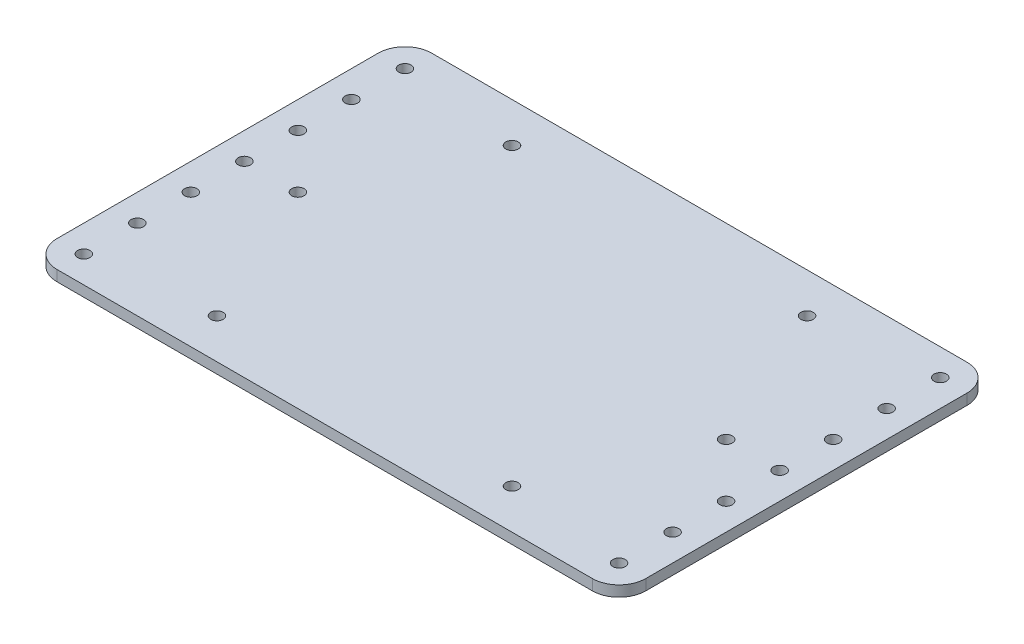
ISO-10303-21;
HEADER;
FILE_DESCRIPTION(('STEP AP214'),'2;1');
FILE_NAME('part.step','',(''),(''),'','','');
FILE_SCHEMA(('AUTOMOTIVE_DESIGN { 1 0 10303 214 1 1 1 1 }'));
ENDSEC;
DATA;
#1=APPLICATION_CONTEXT('core data for automotive mechanical design processes');
#2=APPLICATION_PROTOCOL_DEFINITION('international standard','automotive_design',2000,#1);
#3=PRODUCT_CONTEXT('',#1,'mechanical');
#4=PRODUCT('Part','Part','',(#3));
#5=PRODUCT_RELATED_PRODUCT_CATEGORY('part','',(#4));
#6=PRODUCT_DEFINITION_FORMATION('','',#4);
#7=PRODUCT_DEFINITION_CONTEXT('part definition',#1,'design');
#8=PRODUCT_DEFINITION('design','',#6,#7);
#9=PRODUCT_DEFINITION_SHAPE('','',#8);
#10=(LENGTH_UNIT() NAMED_UNIT(*) SI_UNIT(.MILLI.,.METRE.));
#11=(NAMED_UNIT(*) PLANE_ANGLE_UNIT() SI_UNIT($,.RADIAN.));
#12=(NAMED_UNIT(*) SI_UNIT($,.STERADIAN.) SOLID_ANGLE_UNIT());
#13=UNCERTAINTY_MEASURE_WITH_UNIT(LENGTH_MEASURE(1.E-05),#10,'distance_accuracy_value','');
#14=(GEOMETRIC_REPRESENTATION_CONTEXT(3) GLOBAL_UNCERTAINTY_ASSIGNED_CONTEXT((#13)) GLOBAL_UNIT_ASSIGNED_CONTEXT((#10,
#11,#12)) REPRESENTATION_CONTEXT('',''));
#15=CARTESIAN_POINT('',(0.,0.,0.));
#16=DIRECTION('',(0.,0.,1.));
#17=DIRECTION('',(1.,0.,0.));
#18=AXIS2_PLACEMENT_3D('',#15,#16,#17);
#19=CARTESIAN_POINT('',(0.,2.54,0.));
#20=DIRECTION('',(0.,1.,0.));
#21=DIRECTION('',(0.,0.,1.));
#22=AXIS2_PLACEMENT_3D('',#19,#20,#21);
#23=PLANE('',#22);
#24=CARTESIAN_POINT('',(19.0500000000014,2.54,44.45));
#25=DIRECTION('',(0.,1.,0.));
#26=DIRECTION('',(0.,0.,1.));
#27=AXIS2_PLACEMENT_3D('',#24,#25,#26);
#28=CIRCLE('',#27,1.47319999999985);
#29=CARTESIAN_POINT('',(19.0500000000014,2.54,45.9231999999999));
#30=VERTEX_POINT('',#29);
#31=EDGE_CURVE('E351',#30,#30,#28,.T.);
#32=ORIENTED_EDGE('',*,*,#31,.F.);
#33=EDGE_LOOP('',(#32));
#34=FACE_BOUND('',#33,.T.);
#35=CARTESIAN_POINT('',(133.350000000001,2.54,19.0499999999987));
#36=DIRECTION('',(0.,1.,0.));
#37=DIRECTION('',(0.,0.,-1.));
#38=AXIS2_PLACEMENT_3D('',#35,#36,#37);
#39=CIRCLE('',#38,1.4731999999986);
#40=CARTESIAN_POINT('',(133.350000000001,2.54,17.5768));
#41=VERTEX_POINT('',#40);
#42=EDGE_CURVE('E335',#41,#41,#39,.T.);
#43=ORIENTED_EDGE('',*,*,#42,.F.);
#44=EDGE_LOOP('',(#43));
#45=FACE_BOUND('',#44,.T.);
#46=CARTESIAN_POINT('',(133.35,2.54,44.4499999999987));
#47=DIRECTION('',(0.,1.,0.));
#48=DIRECTION('',(0.,0.,-1.));
#49=AXIS2_PLACEMENT_3D('',#46,#47,#48);
#50=CIRCLE('',#49,1.47319999999876);
#51=CARTESIAN_POINT('',(133.35,2.54,42.9767999999999));
#52=VERTEX_POINT('',#51);
#53=EDGE_CURVE('E319',#52,#52,#50,.T.);
#54=ORIENTED_EDGE('',*,*,#53,.F.);
#55=EDGE_LOOP('',(#54));
#56=FACE_BOUND('',#55,.T.);
#57=CARTESIAN_POINT('',(133.350000000001,2.54,69.8499999999987));
#58=DIRECTION('',(0.,1.,0.));
#59=DIRECTION('',(0.,0.,-1.));
#60=AXIS2_PLACEMENT_3D('',#57,#58,#59);
#61=CIRCLE('',#60,1.47319999999829);
#62=CARTESIAN_POINT('',(133.350000000001,2.54,68.3768000000004));
#63=VERTEX_POINT('',#62);
#64=EDGE_CURVE('E303',#63,#63,#61,.T.);
#65=ORIENTED_EDGE('',*,*,#64,.F.);
#66=EDGE_LOOP('',(#65));
#67=FACE_BOUND('',#66,.T.);
#68=CARTESIAN_POINT('',(104.85,2.54,79.4500000000001));
#69=DIRECTION('',(0.,1.,0.));
#70=DIRECTION('',(0.,0.,1.));
#71=AXIS2_PLACEMENT_3D('',#68,#69,#70);
#72=CIRCLE('',#71,1.4732);
#73=CARTESIAN_POINT('',(104.85,2.54,80.9232000000001));
#74=VERTEX_POINT('',#73);
#75=EDGE_CURVE('E287',#74,#74,#72,.T.);
#76=ORIENTED_EDGE('',*,*,#75,.F.);
#77=EDGE_LOOP('',(#76));
#78=FACE_BOUND('',#77,.T.);
#79=CARTESIAN_POINT('',(104.85,2.54,9.44999999999999));
#80=DIRECTION('',(0.,1.,0.));
#81=DIRECTION('',(0.,0.,1.));
#82=AXIS2_PLACEMENT_3D('',#79,#80,#81);
#83=CIRCLE('',#82,1.4732);
#84=CARTESIAN_POINT('',(104.85,2.54,10.9232));
#85=VERTEX_POINT('',#84);
#86=EDGE_CURVE('E271',#85,#85,#83,.T.);
#87=ORIENTED_EDGE('',*,*,#86,.F.);
#88=EDGE_LOOP('',(#87));
#89=FACE_BOUND('',#88,.T.);
#90=CARTESIAN_POINT('',(6.3500000000025,2.54,82.55));
#91=DIRECTION('',(0.,1.,0.));
#92=DIRECTION('',(0.,0.,1.));
#93=AXIS2_PLACEMENT_3D('',#90,#91,#92);
#94=CIRCLE('',#93,1.47319999999836);
#95=CARTESIAN_POINT('',(6.3500000000025,2.54,84.0231999999983));
#96=VERTEX_POINT('',#95);
#97=EDGE_CURVE('E255',#96,#96,#94,.T.);
#98=ORIENTED_EDGE('',*,*,#97,.F.);
#99=EDGE_LOOP('',(#98));
#100=FACE_BOUND('',#99,.T.);
#101=CARTESIAN_POINT('',(6.35000000000224,2.54,57.15));
#102=DIRECTION('',(0.,1.,0.));
#103=DIRECTION('',(0.,0.,1.));
#104=AXIS2_PLACEMENT_3D('',#101,#102,#103);
#105=CIRCLE('',#104,1.47319999999836);
#106=CARTESIAN_POINT('',(6.35000000000224,2.54,58.6231999999983));
#107=VERTEX_POINT('',#106);
#108=EDGE_CURVE('E239',#107,#107,#105,.T.);
#109=ORIENTED_EDGE('',*,*,#108,.F.);
#110=EDGE_LOOP('',(#109));
#111=FACE_BOUND('',#110,.T.);
#112=CARTESIAN_POINT('',(6.35000000000197,2.54,31.75));
#113=DIRECTION('',(0.,1.,0.));
#114=DIRECTION('',(0.,0.,1.));
#115=AXIS2_PLACEMENT_3D('',#112,#113,#114);
#116=CIRCLE('',#115,1.47319999999836);
#117=CARTESIAN_POINT('',(6.35000000000197,2.54,33.2231999999984));
#118=VERTEX_POINT('',#117);
#119=EDGE_CURVE('E223',#118,#118,#116,.T.);
#120=ORIENTED_EDGE('',*,*,#119,.F.);
#121=EDGE_LOOP('',(#120));
#122=FACE_BOUND('',#121,.T.);
#123=CARTESIAN_POINT('',(6.35000000000184,2.54,19.05));
#124=DIRECTION('',(0.,1.,0.));
#125=DIRECTION('',(0.,0.,1.));
#126=AXIS2_PLACEMENT_3D('',#123,#124,#125);
#127=CIRCLE('',#126,1.47319999999836);
#128=CARTESIAN_POINT('',(6.35000000000184,2.54,20.5231999999984));
#129=VERTEX_POINT('',#128);
#130=EDGE_CURVE('E141',#129,#129,#127,.T.);
#131=ORIENTED_EDGE('',*,*,#130,.F.);
#132=EDGE_LOOP('',(#131));
#133=FACE_BOUND('',#132,.T.);
#134=DIRECTION('',(-1.,0.,0.));
#135=VECTOR('',#134,1.);
#136=CARTESIAN_POINT('',(0.,2.54,0.));
#137=LINE('',#136,#135);
#138=CARTESIAN_POINT('',(133.35,2.54,0.));
#139=VERTEX_POINT('',#138);
#140=CARTESIAN_POINT('',(6.35,2.54,0.));
#141=VERTEX_POINT('',#140);
#142=EDGE_CURVE('E152',#139,#141,#137,.T.);
#143=ORIENTED_EDGE('',*,*,#142,.T.);
#144=CARTESIAN_POINT('',(6.35,2.54,6.35));
#145=DIRECTION('',(0.,1.,0.));
#146=DIRECTION('',(0.,0.,1.));
#147=AXIS2_PLACEMENT_3D('',#144,#145,#146);
#148=CIRCLE('',#147,6.35);
#149=CARTESIAN_POINT('',(0.,2.54,6.35));
#150=VERTEX_POINT('',#149);
#151=EDGE_CURVE('E182',#141,#150,#148,.T.);
#152=ORIENTED_EDGE('',*,*,#151,.T.);
#153=DIRECTION('',(0.,0.,1.));
#154=VECTOR('',#153,1.);
#155=CARTESIAN_POINT('',(0.,2.54,0.));
#156=LINE('',#155,#154);
#157=CARTESIAN_POINT('',(0.,2.54,82.55));
#158=VERTEX_POINT('',#157);
#159=EDGE_CURVE('E131',#150,#158,#156,.T.);
#160=ORIENTED_EDGE('',*,*,#159,.T.);
#161=CARTESIAN_POINT('',(6.35,2.54,82.55));
#162=DIRECTION('',(0.,1.,0.));
#163=DIRECTION('',(0.,0.,1.));
#164=AXIS2_PLACEMENT_3D('',#161,#162,#163);
#165=CIRCLE('',#164,6.35);
#166=CARTESIAN_POINT('',(6.35,2.54,88.9));
#167=VERTEX_POINT('',#166);
#168=EDGE_CURVE('E174',#158,#167,#165,.T.);
#169=ORIENTED_EDGE('',*,*,#168,.T.);
#170=DIRECTION('',(1.,0.,0.));
#171=VECTOR('',#170,1.);
#172=CARTESIAN_POINT('',(0.,2.54,88.9));
#173=LINE('',#172,#171);
#174=CARTESIAN_POINT('',(133.35,2.54,88.9));
#175=VERTEX_POINT('',#174);
#176=EDGE_CURVE('E197',#167,#175,#173,.T.);
#177=ORIENTED_EDGE('',*,*,#176,.T.);
#178=CARTESIAN_POINT('',(133.35,2.54,82.55));
#179=DIRECTION('',(0.,1.,0.));
#180=DIRECTION('',(0.,0.,1.));
#181=AXIS2_PLACEMENT_3D('',#178,#179,#180);
#182=CIRCLE('',#181,6.35);
#183=CARTESIAN_POINT('',(139.7,2.54,82.55));
#184=VERTEX_POINT('',#183);
#185=EDGE_CURVE('E66',#175,#184,#182,.T.);
#186=ORIENTED_EDGE('',*,*,#185,.T.);
#187=DIRECTION('',(0.,0.,-1.));
#188=VECTOR('',#187,1.);
#189=CARTESIAN_POINT('',(139.7,2.54,0.));
#190=LINE('',#189,#188);
#191=CARTESIAN_POINT('',(139.7,2.54,6.35));
#192=VERTEX_POINT('',#191);
#193=EDGE_CURVE('E205',#184,#192,#190,.T.);
#194=ORIENTED_EDGE('',*,*,#193,.T.);
#195=CARTESIAN_POINT('',(133.35,2.54,6.35));
#196=DIRECTION('',(0.,1.,0.));
#197=DIRECTION('',(0.,0.,1.));
#198=AXIS2_PLACEMENT_3D('',#195,#196,#197);
#199=CIRCLE('',#198,6.35);
#200=EDGE_CURVE('E179',#192,#139,#199,.T.);
#201=ORIENTED_EDGE('',*,*,#200,.T.);
#202=EDGE_LOOP('',(#143,#152,#160,#169,#177,#186,#194,#201));
#203=FACE_BOUND('',#202,.T.);
#204=CARTESIAN_POINT('',(6.35000000000171,2.54,6.34999999999999));
#205=DIRECTION('',(0.,1.,0.));
#206=DIRECTION('',(0.,0.,1.));
#207=AXIS2_PLACEMENT_3D('',#204,#205,#206);
#208=CIRCLE('',#207,1.47319999999836);
#209=CARTESIAN_POINT('',(6.35000000000171,2.54,7.82319999999836));
#210=VERTEX_POINT('',#209);
#211=EDGE_CURVE('E217',#210,#210,#208,.T.);
#212=ORIENTED_EDGE('',*,*,#211,.F.);
#213=EDGE_LOOP('',(#212));
#214=FACE_BOUND('',#213,.T.);
#215=CARTESIAN_POINT('',(6.3500000000021,2.54,44.45));
#216=DIRECTION('',(0.,1.,0.));
#217=DIRECTION('',(0.,0.,1.));
#218=AXIS2_PLACEMENT_3D('',#215,#216,#217);
#219=CIRCLE('',#218,1.47319999999836);
#220=CARTESIAN_POINT('',(6.3500000000021,2.54,45.9231999999984));
#221=VERTEX_POINT('',#220);
#222=EDGE_CURVE('E231',#221,#221,#219,.T.);
#223=ORIENTED_EDGE('',*,*,#222,.F.);
#224=EDGE_LOOP('',(#223));
#225=FACE_BOUND('',#224,.T.);
#226=CARTESIAN_POINT('',(6.35000000000237,2.54,69.85));
#227=DIRECTION('',(0.,1.,0.));
#228=DIRECTION('',(0.,0.,1.));
#229=AXIS2_PLACEMENT_3D('',#226,#227,#228);
#230=CIRCLE('',#229,1.47319999999836);
#231=CARTESIAN_POINT('',(6.35000000000237,2.54,71.3231999999983));
#232=VERTEX_POINT('',#231);
#233=EDGE_CURVE('E247',#232,#232,#230,.T.);
#234=ORIENTED_EDGE('',*,*,#233,.F.);
#235=EDGE_LOOP('',(#234));
#236=FACE_BOUND('',#235,.T.);
#237=CARTESIAN_POINT('',(133.350000000001,2.54,82.5499999999986));
#238=DIRECTION('',(0.,1.,0.));
#239=DIRECTION('',(0.,0.,-1.));
#240=AXIS2_PLACEMENT_3D('',#237,#238,#239);
#241=CIRCLE('',#240,1.47319999999805);
#242=CARTESIAN_POINT('',(133.350000000001,2.54,81.0768000000006));
#243=VERTEX_POINT('',#242);
#244=EDGE_CURVE('E263',#243,#243,#241,.T.);
#245=ORIENTED_EDGE('',*,*,#244,.F.);
#246=EDGE_LOOP('',(#245));
#247=FACE_BOUND('',#246,.T.);
#248=CARTESIAN_POINT('',(34.85,2.54,9.44999999999999));
#249=DIRECTION('',(0.,1.,0.));
#250=DIRECTION('',(0.,0.,1.));
#251=AXIS2_PLACEMENT_3D('',#248,#249,#250);
#252=CIRCLE('',#251,1.4732);
#253=CARTESIAN_POINT('',(34.85,2.54,10.9232));
#254=VERTEX_POINT('',#253);
#255=EDGE_CURVE('E279',#254,#254,#252,.T.);
#256=ORIENTED_EDGE('',*,*,#255,.F.);
#257=EDGE_LOOP('',(#256));
#258=FACE_BOUND('',#257,.T.);
#259=CARTESIAN_POINT('',(34.85,2.54,79.4500000000001));
#260=DIRECTION('',(0.,1.,0.));
#261=DIRECTION('',(0.,0.,1.));
#262=AXIS2_PLACEMENT_3D('',#259,#260,#261);
#263=CIRCLE('',#262,1.47320000000024);
#264=CARTESIAN_POINT('',(34.85,2.54,80.9232000000004));
#265=VERTEX_POINT('',#264);
#266=EDGE_CURVE('E295',#265,#265,#263,.T.);
#267=ORIENTED_EDGE('',*,*,#266,.F.);
#268=EDGE_LOOP('',(#267));
#269=FACE_BOUND('',#268,.T.);
#270=CARTESIAN_POINT('',(133.350000000001,2.54,57.1499999999987));
#271=DIRECTION('',(0.,1.,0.));
#272=DIRECTION('',(0.,0.,-1.));
#273=AXIS2_PLACEMENT_3D('',#270,#271,#272);
#274=CIRCLE('',#273,1.47319999999858);
#275=CARTESIAN_POINT('',(133.350000000001,2.54,55.6768000000001));
#276=VERTEX_POINT('',#275);
#277=EDGE_CURVE('E311',#276,#276,#274,.T.);
#278=ORIENTED_EDGE('',*,*,#277,.F.);
#279=EDGE_LOOP('',(#278));
#280=FACE_BOUND('',#279,.T.);
#281=CARTESIAN_POINT('',(133.350000000001,2.54,31.7499999999987));
#282=DIRECTION('',(0.,1.,0.));
#283=DIRECTION('',(0.,0.,-1.));
#284=AXIS2_PLACEMENT_3D('',#281,#282,#283);
#285=CIRCLE('',#284,1.47319999999837);
#286=CARTESIAN_POINT('',(133.350000000001,2.54,30.2768000000003));
#287=VERTEX_POINT('',#286);
#288=EDGE_CURVE('E327',#287,#287,#285,.T.);
#289=ORIENTED_EDGE('',*,*,#288,.F.);
#290=EDGE_LOOP('',(#289));
#291=FACE_BOUND('',#290,.T.);
#292=CARTESIAN_POINT('',(133.350000000001,2.54,6.34999999999866));
#293=DIRECTION('',(0.,1.,0.));
#294=DIRECTION('',(0.,0.,-1.));
#295=AXIS2_PLACEMENT_3D('',#292,#293,#294);
#296=CIRCLE('',#295,1.47319999999882);
#297=CARTESIAN_POINT('',(133.350000000001,2.54,4.87679999999984));
#298=VERTEX_POINT('',#297);
#299=EDGE_CURVE('E343',#298,#298,#296,.T.);
#300=ORIENTED_EDGE('',*,*,#299,.F.);
#301=EDGE_LOOP('',(#300));
#302=FACE_BOUND('',#301,.T.);
#303=CARTESIAN_POINT('',(120.650000000001,2.54,44.45));
#304=DIRECTION('',(0.,1.,0.));
#305=DIRECTION('',(0.,0.,1.));
#306=AXIS2_PLACEMENT_3D('',#303,#304,#305);
#307=CIRCLE('',#306,1.47319999999977);
#308=CARTESIAN_POINT('',(120.650000000001,2.54,45.9231999999998));
#309=VERTEX_POINT('',#308);
#310=EDGE_CURVE('E359',#309,#309,#307,.T.);
#311=ORIENTED_EDGE('',*,*,#310,.F.);
#312=EDGE_LOOP('',(#311));
#313=FACE_BOUND('',#312,.T.);
#314=ADVANCED_FACE('F43',(#34,#45,#56,#67,#78,#89,#100,#111,#122,#133,#203,#214,#225,#236,#247,
#258,#269,#280,#291,#302,#313),#23,.T.);
#315=CARTESIAN_POINT('',(0.,0.,0.));
#316=DIRECTION('',(0.,1.,0.));
#317=DIRECTION('',(0.,0.,1.));
#318=AXIS2_PLACEMENT_3D('',#315,#316,#317);
#319=PLANE('',#318);
#320=DIRECTION('',(0.,0.,1.));
#321=VECTOR('',#320,1.);
#322=CARTESIAN_POINT('',(0.,0.,0.));
#323=LINE('',#322,#321);
#324=CARTESIAN_POINT('',(0.,0.,6.35));
#325=VERTEX_POINT('',#324);
#326=CARTESIAN_POINT('',(0.,0.,82.55));
#327=VERTEX_POINT('',#326);
#328=EDGE_CURVE('E128',#325,#327,#323,.T.);
#329=ORIENTED_EDGE('',*,*,#328,.F.);
#330=CARTESIAN_POINT('',(6.35,0.,6.35));
#331=DIRECTION('',(0.,1.,0.));
#332=DIRECTION('',(0.,0.,1.));
#333=AXIS2_PLACEMENT_3D('',#330,#331,#332);
#334=CIRCLE('',#333,6.35);
#335=CARTESIAN_POINT('',(6.35,0.,0.));
#336=VERTEX_POINT('',#335);
#337=EDGE_CURVE('E110',#325,#336,#334,.F.);
#338=ORIENTED_EDGE('',*,*,#337,.T.);
#339=DIRECTION('',(-1.,0.,0.));
#340=VECTOR('',#339,1.);
#341=CARTESIAN_POINT('',(0.,0.,0.));
#342=LINE('',#341,#340);
#343=CARTESIAN_POINT('',(133.35,0.,0.));
#344=VERTEX_POINT('',#343);
#345=EDGE_CURVE('E157',#344,#336,#342,.T.);
#346=ORIENTED_EDGE('',*,*,#345,.F.);
#347=CARTESIAN_POINT('',(133.35,0.,6.35));
#348=DIRECTION('',(0.,1.,0.));
#349=DIRECTION('',(0.,0.,1.));
#350=AXIS2_PLACEMENT_3D('',#347,#348,#349);
#351=CIRCLE('',#350,6.35);
#352=CARTESIAN_POINT('',(139.7,0.,6.35));
#353=VERTEX_POINT('',#352);
#354=EDGE_CURVE('E122',#344,#353,#351,.F.);
#355=ORIENTED_EDGE('',*,*,#354,.T.);
#356=DIRECTION('',(0.,0.,-1.));
#357=VECTOR('',#356,1.);
#358=CARTESIAN_POINT('',(139.7,0.,0.));
#359=LINE('',#358,#357);
#360=CARTESIAN_POINT('',(139.7,0.,82.55));
#361=VERTEX_POINT('',#360);
#362=EDGE_CURVE('E146',#361,#353,#359,.T.);
#363=ORIENTED_EDGE('',*,*,#362,.F.);
#364=CARTESIAN_POINT('',(133.35,0.,82.55));
#365=DIRECTION('',(0.,1.,0.));
#366=DIRECTION('',(0.,0.,1.));
#367=AXIS2_PLACEMENT_3D('',#364,#365,#366);
#368=CIRCLE('',#367,6.35);
#369=CARTESIAN_POINT('',(133.35,0.,88.9));
#370=VERTEX_POINT('',#369);
#371=EDGE_CURVE('E164',#361,#370,#368,.F.);
#372=ORIENTED_EDGE('',*,*,#371,.T.);
#373=DIRECTION('',(1.,0.,0.));
#374=VECTOR('',#373,1.);
#375=CARTESIAN_POINT('',(0.,0.,88.9));
#376=LINE('',#375,#374);
#377=CARTESIAN_POINT('',(6.35,0.,88.9));
#378=VERTEX_POINT('',#377);
#379=EDGE_CURVE('E140',#378,#370,#376,.T.);
#380=ORIENTED_EDGE('',*,*,#379,.F.);
#381=CARTESIAN_POINT('',(6.35,0.,82.55));
#382=DIRECTION('',(0.,1.,0.));
#383=DIRECTION('',(0.,0.,1.));
#384=AXIS2_PLACEMENT_3D('',#381,#382,#383);
#385=CIRCLE('',#384,6.35);
#386=EDGE_CURVE('E133',#378,#327,#385,.F.);
#387=ORIENTED_EDGE('',*,*,#386,.T.);
#388=EDGE_LOOP('',(#329,#338,#346,#355,#363,#372,#380,#387));
#389=FACE_BOUND('',#388,.T.);
#390=CARTESIAN_POINT('',(6.35000000000184,0.,19.05));
#391=DIRECTION('',(0.,1.,0.));
#392=DIRECTION('',(0.,0.,1.));
#393=AXIS2_PLACEMENT_3D('',#390,#391,#392);
#394=CIRCLE('',#393,1.47319999999836);
#395=CARTESIAN_POINT('',(6.35000000000184,0.,20.5231999999984));
#396=VERTEX_POINT('',#395);
#397=EDGE_CURVE('E149',#396,#396,#394,.T.);
#398=ORIENTED_EDGE('',*,*,#397,.T.);
#399=EDGE_LOOP('',(#398));
#400=FACE_BOUND('',#399,.T.);
#401=CARTESIAN_POINT('',(6.35000000000171,0.,6.34999999999999));
#402=DIRECTION('',(0.,1.,0.));
#403=DIRECTION('',(0.,0.,1.));
#404=AXIS2_PLACEMENT_3D('',#401,#402,#403);
#405=CIRCLE('',#404,1.47319999999836);
#406=CARTESIAN_POINT('',(6.35000000000171,0.,7.82319999999836));
#407=VERTEX_POINT('',#406);
#408=EDGE_CURVE('E219',#407,#407,#405,.T.);
#409=ORIENTED_EDGE('',*,*,#408,.T.);
#410=EDGE_LOOP('',(#409));
#411=FACE_BOUND('',#410,.T.);
#412=CARTESIAN_POINT('',(6.35000000000197,0.,31.75));
#413=DIRECTION('',(0.,1.,0.));
#414=DIRECTION('',(0.,0.,1.));
#415=AXIS2_PLACEMENT_3D('',#412,#413,#414);
#416=CIRCLE('',#415,1.47319999999836);
#417=CARTESIAN_POINT('',(6.35000000000197,0.,33.2231999999984));
#418=VERTEX_POINT('',#417);
#419=EDGE_CURVE('E227',#418,#418,#416,.T.);
#420=ORIENTED_EDGE('',*,*,#419,.T.);
#421=EDGE_LOOP('',(#420));
#422=FACE_BOUND('',#421,.T.);
#423=CARTESIAN_POINT('',(6.3500000000021,0.,44.45));
#424=DIRECTION('',(0.,1.,0.));
#425=DIRECTION('',(0.,0.,1.));
#426=AXIS2_PLACEMENT_3D('',#423,#424,#425);
#427=CIRCLE('',#426,1.47319999999836);
#428=CARTESIAN_POINT('',(6.3500000000021,0.,45.9231999999984));
#429=VERTEX_POINT('',#428);
#430=EDGE_CURVE('E235',#429,#429,#427,.T.);
#431=ORIENTED_EDGE('',*,*,#430,.T.);
#432=EDGE_LOOP('',(#431));
#433=FACE_BOUND('',#432,.T.);
#434=CARTESIAN_POINT('',(6.35000000000224,0.,57.15));
#435=DIRECTION('',(0.,1.,0.));
#436=DIRECTION('',(0.,0.,1.));
#437=AXIS2_PLACEMENT_3D('',#434,#435,#436);
#438=CIRCLE('',#437,1.47319999999836);
#439=CARTESIAN_POINT('',(6.35000000000224,0.,58.6231999999983));
#440=VERTEX_POINT('',#439);
#441=EDGE_CURVE('E243',#440,#440,#438,.T.);
#442=ORIENTED_EDGE('',*,*,#441,.T.);
#443=EDGE_LOOP('',(#442));
#444=FACE_BOUND('',#443,.T.);
#445=CARTESIAN_POINT('',(6.35000000000237,0.,69.85));
#446=DIRECTION('',(0.,1.,0.));
#447=DIRECTION('',(0.,0.,1.));
#448=AXIS2_PLACEMENT_3D('',#445,#446,#447);
#449=CIRCLE('',#448,1.47319999999836);
#450=CARTESIAN_POINT('',(6.35000000000237,0.,71.3231999999983));
#451=VERTEX_POINT('',#450);
#452=EDGE_CURVE('E251',#451,#451,#449,.T.);
#453=ORIENTED_EDGE('',*,*,#452,.T.);
#454=EDGE_LOOP('',(#453));
#455=FACE_BOUND('',#454,.T.);
#456=CARTESIAN_POINT('',(6.3500000000025,0.,82.55));
#457=DIRECTION('',(0.,1.,0.));
#458=DIRECTION('',(0.,0.,1.));
#459=AXIS2_PLACEMENT_3D('',#456,#457,#458);
#460=CIRCLE('',#459,1.47319999999836);
#461=CARTESIAN_POINT('',(6.3500000000025,0.,84.0231999999983));
#462=VERTEX_POINT('',#461);
#463=EDGE_CURVE('E259',#462,#462,#460,.T.);
#464=ORIENTED_EDGE('',*,*,#463,.T.);
#465=EDGE_LOOP('',(#464));
#466=FACE_BOUND('',#465,.T.);
#467=CARTESIAN_POINT('',(133.350000000001,0.,82.5499999999986));
#468=DIRECTION('',(0.,1.,0.));
#469=DIRECTION('',(0.,0.,-1.));
#470=AXIS2_PLACEMENT_3D('',#467,#468,#469);
#471=CIRCLE('',#470,1.47319999999805);
#472=CARTESIAN_POINT('',(133.350000000001,0.,81.0768000000006));
#473=VERTEX_POINT('',#472);
#474=EDGE_CURVE('E267',#473,#473,#471,.T.);
#475=ORIENTED_EDGE('',*,*,#474,.T.);
#476=EDGE_LOOP('',(#475));
#477=FACE_BOUND('',#476,.T.);
#478=CARTESIAN_POINT('',(104.85,0.,9.44999999999999));
#479=DIRECTION('',(0.,1.,0.));
#480=DIRECTION('',(0.,0.,1.));
#481=AXIS2_PLACEMENT_3D('',#478,#479,#480);
#482=CIRCLE('',#481,1.4732);
#483=CARTESIAN_POINT('',(104.85,0.,10.9232));
#484=VERTEX_POINT('',#483);
#485=EDGE_CURVE('E275',#484,#484,#482,.T.);
#486=ORIENTED_EDGE('',*,*,#485,.T.);
#487=EDGE_LOOP('',(#486));
#488=FACE_BOUND('',#487,.T.);
#489=CARTESIAN_POINT('',(34.85,0.,9.44999999999999));
#490=DIRECTION('',(0.,1.,0.));
#491=DIRECTION('',(0.,0.,1.));
#492=AXIS2_PLACEMENT_3D('',#489,#490,#491);
#493=CIRCLE('',#492,1.4732);
#494=CARTESIAN_POINT('',(34.85,0.,10.9232));
#495=VERTEX_POINT('',#494);
#496=EDGE_CURVE('E283',#495,#495,#493,.T.);
#497=ORIENTED_EDGE('',*,*,#496,.T.);
#498=EDGE_LOOP('',(#497));
#499=FACE_BOUND('',#498,.T.);
#500=CARTESIAN_POINT('',(104.85,0.,79.4500000000001));
#501=DIRECTION('',(0.,1.,0.));
#502=DIRECTION('',(0.,0.,1.));
#503=AXIS2_PLACEMENT_3D('',#500,#501,#502);
#504=CIRCLE('',#503,1.4732);
#505=CARTESIAN_POINT('',(104.85,0.,80.9232000000001));
#506=VERTEX_POINT('',#505);
#507=EDGE_CURVE('E291',#506,#506,#504,.T.);
#508=ORIENTED_EDGE('',*,*,#507,.T.);
#509=EDGE_LOOP('',(#508));
#510=FACE_BOUND('',#509,.T.);
#511=CARTESIAN_POINT('',(34.85,0.,79.4500000000001));
#512=DIRECTION('',(0.,1.,0.));
#513=DIRECTION('',(0.,0.,1.));
#514=AXIS2_PLACEMENT_3D('',#511,#512,#513);
#515=CIRCLE('',#514,1.47320000000024);
#516=CARTESIAN_POINT('',(34.85,0.,80.9232000000004));
#517=VERTEX_POINT('',#516);
#518=EDGE_CURVE('E299',#517,#517,#515,.T.);
#519=ORIENTED_EDGE('',*,*,#518,.T.);
#520=EDGE_LOOP('',(#519));
#521=FACE_BOUND('',#520,.T.);
#522=CARTESIAN_POINT('',(133.350000000001,0.,69.8499999999987));
#523=DIRECTION('',(0.,1.,0.));
#524=DIRECTION('',(0.,0.,-1.));
#525=AXIS2_PLACEMENT_3D('',#522,#523,#524);
#526=CIRCLE('',#525,1.47319999999829);
#527=CARTESIAN_POINT('',(133.350000000001,0.,68.3768000000004));
#528=VERTEX_POINT('',#527);
#529=EDGE_CURVE('E307',#528,#528,#526,.T.);
#530=ORIENTED_EDGE('',*,*,#529,.T.);
#531=EDGE_LOOP('',(#530));
#532=FACE_BOUND('',#531,.T.);
#533=CARTESIAN_POINT('',(133.350000000001,0.,57.1499999999987));
#534=DIRECTION('',(0.,1.,0.));
#535=DIRECTION('',(0.,0.,-1.));
#536=AXIS2_PLACEMENT_3D('',#533,#534,#535);
#537=CIRCLE('',#536,1.47319999999858);
#538=CARTESIAN_POINT('',(133.350000000001,0.,55.6768000000001));
#539=VERTEX_POINT('',#538);
#540=EDGE_CURVE('E315',#539,#539,#537,.T.);
#541=ORIENTED_EDGE('',*,*,#540,.T.);
#542=EDGE_LOOP('',(#541));
#543=FACE_BOUND('',#542,.T.);
#544=CARTESIAN_POINT('',(133.35,0.,44.4499999999987));
#545=DIRECTION('',(0.,1.,0.));
#546=DIRECTION('',(0.,0.,-1.));
#547=AXIS2_PLACEMENT_3D('',#544,#545,#546);
#548=CIRCLE('',#547,1.47319999999876);
#549=CARTESIAN_POINT('',(133.35,0.,42.9767999999999));
#550=VERTEX_POINT('',#549);
#551=EDGE_CURVE('E323',#550,#550,#548,.T.);
#552=ORIENTED_EDGE('',*,*,#551,.T.);
#553=EDGE_LOOP('',(#552));
#554=FACE_BOUND('',#553,.T.);
#555=CARTESIAN_POINT('',(133.350000000001,0.,31.7499999999987));
#556=DIRECTION('',(0.,1.,0.));
#557=DIRECTION('',(0.,0.,-1.));
#558=AXIS2_PLACEMENT_3D('',#555,#556,#557);
#559=CIRCLE('',#558,1.47319999999837);
#560=CARTESIAN_POINT('',(133.350000000001,0.,30.2768000000003));
#561=VERTEX_POINT('',#560);
#562=EDGE_CURVE('E331',#561,#561,#559,.T.);
#563=ORIENTED_EDGE('',*,*,#562,.T.);
#564=EDGE_LOOP('',(#563));
#565=FACE_BOUND('',#564,.T.);
#566=CARTESIAN_POINT('',(133.350000000001,0.,19.0499999999987));
#567=DIRECTION('',(0.,1.,0.));
#568=DIRECTION('',(0.,0.,-1.));
#569=AXIS2_PLACEMENT_3D('',#566,#567,#568);
#570=CIRCLE('',#569,1.4731999999986);
#571=CARTESIAN_POINT('',(133.350000000001,0.,17.5768));
#572=VERTEX_POINT('',#571);
#573=EDGE_CURVE('E339',#572,#572,#570,.T.);
#574=ORIENTED_EDGE('',*,*,#573,.T.);
#575=EDGE_LOOP('',(#574));
#576=FACE_BOUND('',#575,.T.);
#577=CARTESIAN_POINT('',(133.350000000001,0.,6.34999999999866));
#578=DIRECTION('',(0.,1.,0.));
#579=DIRECTION('',(0.,0.,-1.));
#580=AXIS2_PLACEMENT_3D('',#577,#578,#579);
#581=CIRCLE('',#580,1.47319999999882);
#582=CARTESIAN_POINT('',(133.350000000001,0.,4.87679999999984));
#583=VERTEX_POINT('',#582);
#584=EDGE_CURVE('E347',#583,#583,#581,.T.);
#585=ORIENTED_EDGE('',*,*,#584,.T.);
#586=EDGE_LOOP('',(#585));
#587=FACE_BOUND('',#586,.T.);
#588=CARTESIAN_POINT('',(19.0500000000014,0.,44.45));
#589=DIRECTION('',(0.,1.,0.));
#590=DIRECTION('',(0.,0.,1.));
#591=AXIS2_PLACEMENT_3D('',#588,#589,#590);
#592=CIRCLE('',#591,1.47319999999985);
#593=CARTESIAN_POINT('',(19.0500000000014,0.,45.9231999999999));
#594=VERTEX_POINT('',#593);
#595=EDGE_CURVE('E355',#594,#594,#592,.T.);
#596=ORIENTED_EDGE('',*,*,#595,.T.);
#597=EDGE_LOOP('',(#596));
#598=FACE_BOUND('',#597,.T.);
#599=CARTESIAN_POINT('',(120.650000000001,0.,44.45));
#600=DIRECTION('',(0.,1.,0.));
#601=DIRECTION('',(0.,0.,1.));
#602=AXIS2_PLACEMENT_3D('',#599,#600,#601);
#603=CIRCLE('',#602,1.47319999999977);
#604=CARTESIAN_POINT('',(120.650000000001,0.,45.9231999999998));
#605=VERTEX_POINT('',#604);
#606=EDGE_CURVE('E363',#605,#605,#603,.T.);
#607=ORIENTED_EDGE('',*,*,#606,.T.);
#608=EDGE_LOOP('',(#607));
#609=FACE_BOUND('',#608,.T.);
#610=ADVANCED_FACE('F136',(#389,#400,#411,#422,#433,#444,#455,#466,#477,#488,#499,#510,#521,
#532,#543,#554,#565,#576,#587,#598,#609),#319,.F.);
#611=CARTESIAN_POINT('',(0.,2.54,0.));
#612=DIRECTION('',(1.,0.,0.));
#613=DIRECTION('',(0.,0.,-1.));
#614=AXIS2_PLACEMENT_3D('',#611,#612,#613);
#615=PLANE('',#614);
#616=ORIENTED_EDGE('',*,*,#159,.F.);
#617=DIRECTION('',(0.,-1.,0.));
#618=VECTOR('',#617,1.);
#619=CARTESIAN_POINT('',(0.,2.54,6.35));
#620=LINE('',#619,#618);
#621=EDGE_CURVE('E114',#150,#325,#620,.T.);
#622=ORIENTED_EDGE('',*,*,#621,.T.);
#623=ORIENTED_EDGE('',*,*,#328,.T.);
#624=DIRECTION('',(0.,-1.,0.));
#625=VECTOR('',#624,1.);
#626=CARTESIAN_POINT('',(0.,2.54,82.55));
#627=LINE('',#626,#625);
#628=EDGE_CURVE('E134',#327,#158,#627,.F.);
#629=ORIENTED_EDGE('',*,*,#628,.T.);
#630=EDGE_LOOP('',(#616,#622,#623,#629));
#631=FACE_BOUND('',#630,.T.);
#632=ADVANCED_FACE('F127',(#631),#615,.F.);
#633=CARTESIAN_POINT('',(0.,2.54,88.9));
#634=DIRECTION('',(0.,0.,-1.));
#635=DIRECTION('',(-1.,0.,0.));
#636=AXIS2_PLACEMENT_3D('',#633,#634,#635);
#637=PLANE('',#636);
#638=ORIENTED_EDGE('',*,*,#379,.T.);
#639=DIRECTION('',(0.,-1.,0.));
#640=VECTOR('',#639,1.);
#641=CARTESIAN_POINT('',(133.35,2.54,88.9));
#642=LINE('',#641,#640);
#643=EDGE_CURVE('E11',#370,#175,#642,.F.);
#644=ORIENTED_EDGE('',*,*,#643,.T.);
#645=ORIENTED_EDGE('',*,*,#176,.F.);
#646=DIRECTION('',(0.,-1.,0.));
#647=VECTOR('',#646,1.);
#648=CARTESIAN_POINT('',(6.35,2.54,88.9));
#649=LINE('',#648,#647);
#650=EDGE_CURVE('E52',#167,#378,#649,.T.);
#651=ORIENTED_EDGE('',*,*,#650,.T.);
#652=EDGE_LOOP('',(#638,#644,#645,#651));
#653=FACE_BOUND('',#652,.T.);
#654=ADVANCED_FACE('F195',(#653),#637,.F.);
#655=CARTESIAN_POINT('',(139.7,2.54,0.));
#656=DIRECTION('',(-1.,0.,0.));
#657=DIRECTION('',(0.,0.,1.));
#658=AXIS2_PLACEMENT_3D('',#655,#656,#657);
#659=PLANE('',#658);
#660=ORIENTED_EDGE('',*,*,#362,.T.);
#661=DIRECTION('',(0.,-1.,0.));
#662=VECTOR('',#661,1.);
#663=CARTESIAN_POINT('',(139.7,2.54,6.35));
#664=LINE('',#663,#662);
#665=EDGE_CURVE('E59',#353,#192,#664,.F.);
#666=ORIENTED_EDGE('',*,*,#665,.T.);
#667=ORIENTED_EDGE('',*,*,#193,.F.);
#668=DIRECTION('',(0.,-1.,0.));
#669=VECTOR('',#668,1.);
#670=CARTESIAN_POINT('',(139.7,2.54,82.55));
#671=LINE('',#670,#669);
#672=EDGE_CURVE('E185',#184,#361,#671,.T.);
#673=ORIENTED_EDGE('',*,*,#672,.T.);
#674=EDGE_LOOP('',(#660,#666,#667,#673));
#675=FACE_BOUND('',#674,.T.);
#676=ADVANCED_FACE('F204',(#675),#659,.F.);
#677=CARTESIAN_POINT('',(0.,2.54,0.));
#678=DIRECTION('',(0.,0.,1.));
#679=DIRECTION('',(1.,0.,0.));
#680=AXIS2_PLACEMENT_3D('',#677,#678,#679);
#681=PLANE('',#680);
#682=ORIENTED_EDGE('',*,*,#345,.T.);
#683=DIRECTION('',(0.,-1.,0.));
#684=VECTOR('',#683,1.);
#685=CARTESIAN_POINT('',(6.35,2.54,0.));
#686=LINE('',#685,#684);
#687=EDGE_CURVE('E115',#336,#141,#686,.F.);
#688=ORIENTED_EDGE('',*,*,#687,.T.);
#689=ORIENTED_EDGE('',*,*,#142,.F.);
#690=DIRECTION('',(0.,-1.,0.));
#691=VECTOR('',#690,1.);
#692=CARTESIAN_POINT('',(133.35,2.54,0.));
#693=LINE('',#692,#691);
#694=EDGE_CURVE('E121',#139,#344,#693,.T.);
#695=ORIENTED_EDGE('',*,*,#694,.T.);
#696=EDGE_LOOP('',(#682,#688,#689,#695));
#697=FACE_BOUND('',#696,.T.);
#698=ADVANCED_FACE('F387',(#697),#681,.F.);
#699=CARTESIAN_POINT('',(6.35000000000184,2.54,19.05));
#700=DIRECTION('',(0.,-1.,0.));
#701=DIRECTION('',(0.,0.,-1.));
#702=AXIS2_PLACEMENT_3D('',#699,#700,#701);
#703=CYLINDRICAL_SURFACE('',#702,1.47319999999836);
#704=ORIENTED_EDGE('',*,*,#130,.T.);
#705=EDGE_LOOP('',(#704));
#706=FACE_BOUND('',#705,.T.);
#707=ORIENTED_EDGE('',*,*,#397,.F.);
#708=EDGE_LOOP('',(#707));
#709=FACE_BOUND('',#708,.T.);
#710=ADVANCED_FACE('F384',(#706,#709),#703,.F.);
#711=CARTESIAN_POINT('',(6.35000000000171,2.54,6.34999999999999));
#712=DIRECTION('',(0.,-1.,0.));
#713=DIRECTION('',(0.,0.,-1.));
#714=AXIS2_PLACEMENT_3D('',#711,#712,#713);
#715=CYLINDRICAL_SURFACE('',#714,1.47319999999836);
#716=ORIENTED_EDGE('',*,*,#211,.T.);
#717=EDGE_LOOP('',(#716));
#718=FACE_BOUND('',#717,.T.);
#719=ORIENTED_EDGE('',*,*,#408,.F.);
#720=EDGE_LOOP('',(#719));
#721=FACE_BOUND('',#720,.T.);
#722=ADVANCED_FACE('F506',(#718,#721),#715,.F.);
#723=CARTESIAN_POINT('',(6.35000000000197,2.54,31.75));
#724=DIRECTION('',(0.,-1.,0.));
#725=DIRECTION('',(0.,0.,-1.));
#726=AXIS2_PLACEMENT_3D('',#723,#724,#725);
#727=CYLINDRICAL_SURFACE('',#726,1.47319999999836);
#728=ORIENTED_EDGE('',*,*,#119,.T.);
#729=EDGE_LOOP('',(#728));
#730=FACE_BOUND('',#729,.T.);
#731=ORIENTED_EDGE('',*,*,#419,.F.);
#732=EDGE_LOOP('',(#731));
#733=FACE_BOUND('',#732,.T.);
#734=ADVANCED_FACE('F503',(#730,#733),#727,.F.);
#735=CARTESIAN_POINT('',(6.3500000000021,2.54,44.45));
#736=DIRECTION('',(0.,-1.,0.));
#737=DIRECTION('',(0.,0.,-1.));
#738=AXIS2_PLACEMENT_3D('',#735,#736,#737);
#739=CYLINDRICAL_SURFACE('',#738,1.47319999999836);
#740=ORIENTED_EDGE('',*,*,#222,.T.);
#741=EDGE_LOOP('',(#740));
#742=FACE_BOUND('',#741,.T.);
#743=ORIENTED_EDGE('',*,*,#430,.F.);
#744=EDGE_LOOP('',(#743));
#745=FACE_BOUND('',#744,.T.);
#746=ADVANCED_FACE('F499',(#742,#745),#739,.F.);
#747=CARTESIAN_POINT('',(6.35000000000224,2.54,57.15));
#748=DIRECTION('',(0.,-1.,0.));
#749=DIRECTION('',(0.,0.,-1.));
#750=AXIS2_PLACEMENT_3D('',#747,#748,#749);
#751=CYLINDRICAL_SURFACE('',#750,1.47319999999836);
#752=ORIENTED_EDGE('',*,*,#108,.T.);
#753=EDGE_LOOP('',(#752));
#754=FACE_BOUND('',#753,.T.);
#755=ORIENTED_EDGE('',*,*,#441,.F.);
#756=EDGE_LOOP('',(#755));
#757=FACE_BOUND('',#756,.T.);
#758=ADVANCED_FACE('F495',(#754,#757),#751,.F.);
#759=CARTESIAN_POINT('',(6.35000000000237,2.54,69.85));
#760=DIRECTION('',(0.,-1.,0.));
#761=DIRECTION('',(0.,0.,-1.));
#762=AXIS2_PLACEMENT_3D('',#759,#760,#761);
#763=CYLINDRICAL_SURFACE('',#762,1.47319999999836);
#764=ORIENTED_EDGE('',*,*,#233,.T.);
#765=EDGE_LOOP('',(#764));
#766=FACE_BOUND('',#765,.T.);
#767=ORIENTED_EDGE('',*,*,#452,.F.);
#768=EDGE_LOOP('',(#767));
#769=FACE_BOUND('',#768,.T.);
#770=ADVANCED_FACE('F491',(#766,#769),#763,.F.);
#771=CARTESIAN_POINT('',(6.3500000000025,2.54,82.55));
#772=DIRECTION('',(0.,-1.,0.));
#773=DIRECTION('',(0.,0.,-1.));
#774=AXIS2_PLACEMENT_3D('',#771,#772,#773);
#775=CYLINDRICAL_SURFACE('',#774,1.47319999999836);
#776=ORIENTED_EDGE('',*,*,#97,.T.);
#777=EDGE_LOOP('',(#776));
#778=FACE_BOUND('',#777,.T.);
#779=ORIENTED_EDGE('',*,*,#463,.F.);
#780=EDGE_LOOP('',(#779));
#781=FACE_BOUND('',#780,.T.);
#782=ADVANCED_FACE('F487',(#778,#781),#775,.F.);
#783=CARTESIAN_POINT('',(133.350000000001,2.54,82.5499999999986));
#784=DIRECTION('',(0.,-1.,0.));
#785=DIRECTION('',(0.,0.,-1.));
#786=AXIS2_PLACEMENT_3D('',#783,#784,#785);
#787=CYLINDRICAL_SURFACE('',#786,1.47319999999805);
#788=ORIENTED_EDGE('',*,*,#244,.T.);
#789=EDGE_LOOP('',(#788));
#790=FACE_BOUND('',#789,.T.);
#791=ORIENTED_EDGE('',*,*,#474,.F.);
#792=EDGE_LOOP('',(#791));
#793=FACE_BOUND('',#792,.T.);
#794=ADVANCED_FACE('F483',(#790,#793),#787,.F.);
#795=CARTESIAN_POINT('',(104.85,2.54,9.44999999999999));
#796=DIRECTION('',(0.,-1.,0.));
#797=DIRECTION('',(0.,0.,-1.));
#798=AXIS2_PLACEMENT_3D('',#795,#796,#797);
#799=CYLINDRICAL_SURFACE('',#798,1.4732);
#800=ORIENTED_EDGE('',*,*,#86,.T.);
#801=EDGE_LOOP('',(#800));
#802=FACE_BOUND('',#801,.T.);
#803=ORIENTED_EDGE('',*,*,#485,.F.);
#804=EDGE_LOOP('',(#803));
#805=FACE_BOUND('',#804,.T.);
#806=ADVANCED_FACE('F479',(#802,#805),#799,.F.);
#807=CARTESIAN_POINT('',(34.85,2.54,9.44999999999999));
#808=DIRECTION('',(0.,-1.,0.));
#809=DIRECTION('',(0.,0.,-1.));
#810=AXIS2_PLACEMENT_3D('',#807,#808,#809);
#811=CYLINDRICAL_SURFACE('',#810,1.4732);
#812=ORIENTED_EDGE('',*,*,#255,.T.);
#813=EDGE_LOOP('',(#812));
#814=FACE_BOUND('',#813,.T.);
#815=ORIENTED_EDGE('',*,*,#496,.F.);
#816=EDGE_LOOP('',(#815));
#817=FACE_BOUND('',#816,.T.);
#818=ADVANCED_FACE('F475',(#814,#817),#811,.F.);
#819=CARTESIAN_POINT('',(104.85,2.54,79.4500000000001));
#820=DIRECTION('',(0.,-1.,0.));
#821=DIRECTION('',(0.,0.,-1.));
#822=AXIS2_PLACEMENT_3D('',#819,#820,#821);
#823=CYLINDRICAL_SURFACE('',#822,1.4732);
#824=ORIENTED_EDGE('',*,*,#75,.T.);
#825=EDGE_LOOP('',(#824));
#826=FACE_BOUND('',#825,.T.);
#827=ORIENTED_EDGE('',*,*,#507,.F.);
#828=EDGE_LOOP('',(#827));
#829=FACE_BOUND('',#828,.T.);
#830=ADVANCED_FACE('F471',(#826,#829),#823,.F.);
#831=CARTESIAN_POINT('',(34.85,2.54,79.4500000000001));
#832=DIRECTION('',(0.,-1.,0.));
#833=DIRECTION('',(0.,0.,-1.));
#834=AXIS2_PLACEMENT_3D('',#831,#832,#833);
#835=CYLINDRICAL_SURFACE('',#834,1.47320000000024);
#836=ORIENTED_EDGE('',*,*,#266,.T.);
#837=EDGE_LOOP('',(#836));
#838=FACE_BOUND('',#837,.T.);
#839=ORIENTED_EDGE('',*,*,#518,.F.);
#840=EDGE_LOOP('',(#839));
#841=FACE_BOUND('',#840,.T.);
#842=ADVANCED_FACE('F467',(#838,#841),#835,.F.);
#843=CARTESIAN_POINT('',(133.350000000001,2.54,69.8499999999987));
#844=DIRECTION('',(0.,-1.,0.));
#845=DIRECTION('',(0.,0.,-1.));
#846=AXIS2_PLACEMENT_3D('',#843,#844,#845);
#847=CYLINDRICAL_SURFACE('',#846,1.47319999999829);
#848=ORIENTED_EDGE('',*,*,#64,.T.);
#849=EDGE_LOOP('',(#848));
#850=FACE_BOUND('',#849,.T.);
#851=ORIENTED_EDGE('',*,*,#529,.F.);
#852=EDGE_LOOP('',(#851));
#853=FACE_BOUND('',#852,.T.);
#854=ADVANCED_FACE('F463',(#850,#853),#847,.F.);
#855=CARTESIAN_POINT('',(133.350000000001,2.54,57.1499999999987));
#856=DIRECTION('',(0.,-1.,0.));
#857=DIRECTION('',(0.,0.,-1.));
#858=AXIS2_PLACEMENT_3D('',#855,#856,#857);
#859=CYLINDRICAL_SURFACE('',#858,1.47319999999858);
#860=ORIENTED_EDGE('',*,*,#277,.T.);
#861=EDGE_LOOP('',(#860));
#862=FACE_BOUND('',#861,.T.);
#863=ORIENTED_EDGE('',*,*,#540,.F.);
#864=EDGE_LOOP('',(#863));
#865=FACE_BOUND('',#864,.T.);
#866=ADVANCED_FACE('F459',(#862,#865),#859,.F.);
#867=CARTESIAN_POINT('',(133.35,2.54,44.4499999999987));
#868=DIRECTION('',(0.,-1.,0.));
#869=DIRECTION('',(0.,0.,-1.));
#870=AXIS2_PLACEMENT_3D('',#867,#868,#869);
#871=CYLINDRICAL_SURFACE('',#870,1.47319999999876);
#872=ORIENTED_EDGE('',*,*,#53,.T.);
#873=EDGE_LOOP('',(#872));
#874=FACE_BOUND('',#873,.T.);
#875=ORIENTED_EDGE('',*,*,#551,.F.);
#876=EDGE_LOOP('',(#875));
#877=FACE_BOUND('',#876,.T.);
#878=ADVANCED_FACE('F455',(#874,#877),#871,.F.);
#879=CARTESIAN_POINT('',(133.350000000001,2.54,31.7499999999987));
#880=DIRECTION('',(0.,-1.,0.));
#881=DIRECTION('',(0.,0.,-1.));
#882=AXIS2_PLACEMENT_3D('',#879,#880,#881);
#883=CYLINDRICAL_SURFACE('',#882,1.47319999999837);
#884=ORIENTED_EDGE('',*,*,#288,.T.);
#885=EDGE_LOOP('',(#884));
#886=FACE_BOUND('',#885,.T.);
#887=ORIENTED_EDGE('',*,*,#562,.F.);
#888=EDGE_LOOP('',(#887));
#889=FACE_BOUND('',#888,.T.);
#890=ADVANCED_FACE('F451',(#886,#889),#883,.F.);
#891=CARTESIAN_POINT('',(133.350000000001,2.54,19.0499999999987));
#892=DIRECTION('',(0.,-1.,0.));
#893=DIRECTION('',(0.,0.,-1.));
#894=AXIS2_PLACEMENT_3D('',#891,#892,#893);
#895=CYLINDRICAL_SURFACE('',#894,1.4731999999986);
#896=ORIENTED_EDGE('',*,*,#42,.T.);
#897=EDGE_LOOP('',(#896));
#898=FACE_BOUND('',#897,.T.);
#899=ORIENTED_EDGE('',*,*,#573,.F.);
#900=EDGE_LOOP('',(#899));
#901=FACE_BOUND('',#900,.T.);
#902=ADVANCED_FACE('F433',(#898,#901),#895,.F.);
#903=CARTESIAN_POINT('',(133.350000000001,2.54,6.34999999999866));
#904=DIRECTION('',(0.,-1.,0.));
#905=DIRECTION('',(0.,0.,-1.));
#906=AXIS2_PLACEMENT_3D('',#903,#904,#905);
#907=CYLINDRICAL_SURFACE('',#906,1.47319999999882);
#908=ORIENTED_EDGE('',*,*,#299,.T.);
#909=EDGE_LOOP('',(#908));
#910=FACE_BOUND('',#909,.T.);
#911=ORIENTED_EDGE('',*,*,#584,.F.);
#912=EDGE_LOOP('',(#911));
#913=FACE_BOUND('',#912,.T.);
#914=ADVANCED_FACE('F429',(#910,#913),#907,.F.);
#915=CARTESIAN_POINT('',(19.0500000000014,2.54,44.45));
#916=DIRECTION('',(0.,-1.,0.));
#917=DIRECTION('',(0.,0.,-1.));
#918=AXIS2_PLACEMENT_3D('',#915,#916,#917);
#919=CYLINDRICAL_SURFACE('',#918,1.47319999999985);
#920=ORIENTED_EDGE('',*,*,#31,.T.);
#921=EDGE_LOOP('',(#920));
#922=FACE_BOUND('',#921,.T.);
#923=ORIENTED_EDGE('',*,*,#595,.F.);
#924=EDGE_LOOP('',(#923));
#925=FACE_BOUND('',#924,.T.);
#926=ADVANCED_FACE('F432',(#922,#925),#919,.F.);
#927=CARTESIAN_POINT('',(120.650000000001,2.54,44.45));
#928=DIRECTION('',(0.,-1.,0.));
#929=DIRECTION('',(0.,0.,-1.));
#930=AXIS2_PLACEMENT_3D('',#927,#928,#929);
#931=CYLINDRICAL_SURFACE('',#930,1.47319999999977);
#932=ORIENTED_EDGE('',*,*,#310,.T.);
#933=EDGE_LOOP('',(#932));
#934=FACE_BOUND('',#933,.T.);
#935=ORIENTED_EDGE('',*,*,#606,.F.);
#936=EDGE_LOOP('',(#935));
#937=FACE_BOUND('',#936,.T.);
#938=ADVANCED_FACE('F371',(#934,#937),#931,.F.);
#939=CARTESIAN_POINT('',(6.35,2.54,6.35));
#940=DIRECTION('',(0.,-1.,0.));
#941=DIRECTION('',(0.,0.,-1.));
#942=AXIS2_PLACEMENT_3D('',#939,#940,#941);
#943=CYLINDRICAL_SURFACE('',#942,6.35);
#944=ORIENTED_EDGE('',*,*,#151,.F.);
#945=ORIENTED_EDGE('',*,*,#687,.F.);
#946=ORIENTED_EDGE('',*,*,#337,.F.);
#947=ORIENTED_EDGE('',*,*,#621,.F.);
#948=EDGE_LOOP('',(#944,#945,#946,#947));
#949=FACE_BOUND('',#948,.T.);
#950=ADVANCED_FACE('F113',(#949),#943,.T.);
#951=CARTESIAN_POINT('',(133.35,2.54,6.35));
#952=DIRECTION('',(0.,-1.,0.));
#953=DIRECTION('',(0.,0.,-1.));
#954=AXIS2_PLACEMENT_3D('',#951,#952,#953);
#955=CYLINDRICAL_SURFACE('',#954,6.35);
#956=ORIENTED_EDGE('',*,*,#200,.F.);
#957=ORIENTED_EDGE('',*,*,#665,.F.);
#958=ORIENTED_EDGE('',*,*,#354,.F.);
#959=ORIENTED_EDGE('',*,*,#694,.F.);
#960=EDGE_LOOP('',(#956,#957,#958,#959));
#961=FACE_BOUND('',#960,.T.);
#962=ADVANCED_FACE('F399',(#961),#955,.T.);
#963=CARTESIAN_POINT('',(133.35,2.54,82.55));
#964=DIRECTION('',(0.,-1.,0.));
#965=DIRECTION('',(0.,0.,-1.));
#966=AXIS2_PLACEMENT_3D('',#963,#964,#965);
#967=CYLINDRICAL_SURFACE('',#966,6.35);
#968=ORIENTED_EDGE('',*,*,#185,.F.);
#969=ORIENTED_EDGE('',*,*,#643,.F.);
#970=ORIENTED_EDGE('',*,*,#371,.F.);
#971=ORIENTED_EDGE('',*,*,#672,.F.);
#972=EDGE_LOOP('',(#968,#969,#970,#971));
#973=FACE_BOUND('',#972,.T.);
#974=ADVANCED_FACE('F203',(#973),#967,.T.);
#975=CARTESIAN_POINT('',(6.35,2.54,82.55));
#976=DIRECTION('',(0.,-1.,0.));
#977=DIRECTION('',(0.,0.,-1.));
#978=AXIS2_PLACEMENT_3D('',#975,#976,#977);
#979=CYLINDRICAL_SURFACE('',#978,6.35);
#980=ORIENTED_EDGE('',*,*,#168,.F.);
#981=ORIENTED_EDGE('',*,*,#628,.F.);
#982=ORIENTED_EDGE('',*,*,#386,.F.);
#983=ORIENTED_EDGE('',*,*,#650,.F.);
#984=EDGE_LOOP('',(#980,#981,#982,#983));
#985=FACE_BOUND('',#984,.T.);
#986=ADVANCED_FACE('F45',(#985),#979,.T.);
#987=CLOSED_SHELL('',(#314,#610,#632,#654,#676,#698,#710,#722,#734,#746,#758,#770,#782,#794,
#806,#818,#830,#842,#854,#866,#878,#890,#902,#914,#926,#938,#950,#962,#974,#986));
#988=MANIFOLD_SOLID_BREP('B2',#987);
#989=ADVANCED_BREP_SHAPE_REPRESENTATION('',(#18,#988),#14);
#990=SHAPE_DEFINITION_REPRESENTATION(#9,#989);
ENDSEC;
END-ISO-10303-21;
